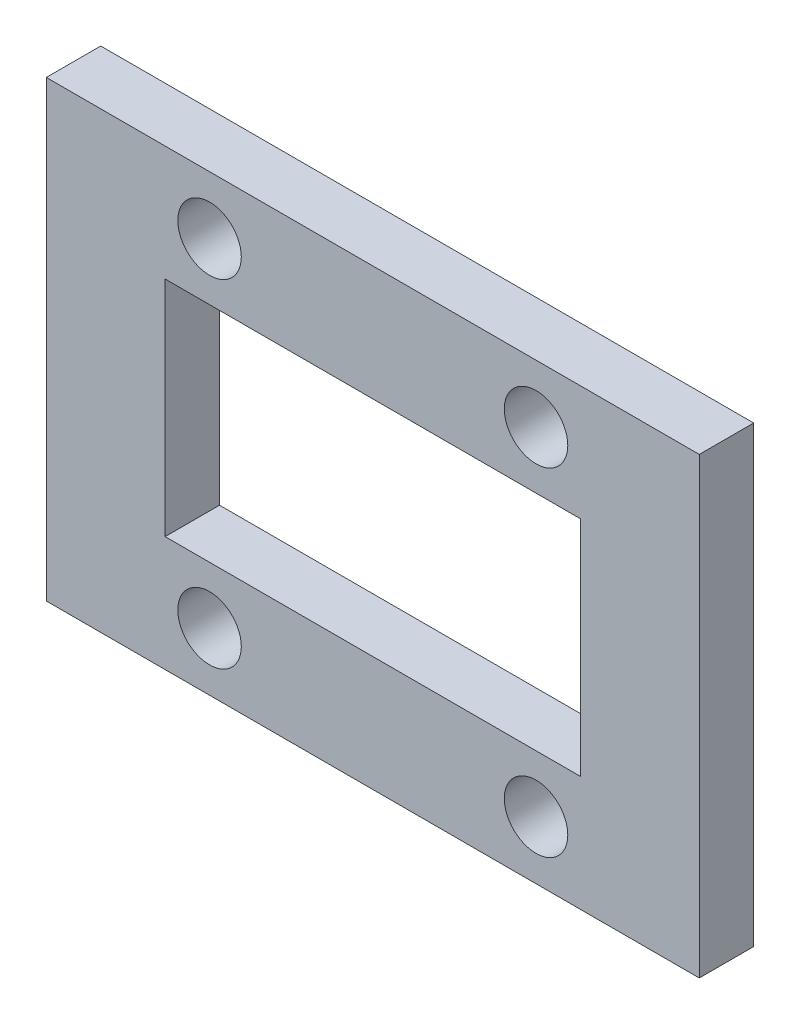
ISO-10303-21;
HEADER;
FILE_DESCRIPTION(('STEP AP214'),'2;1');
FILE_NAME('part.step','',(''),(''),'','','');
FILE_SCHEMA(('AUTOMOTIVE_DESIGN { 1 0 10303 214 1 1 1 1 }'));
ENDSEC;
DATA;
#1=APPLICATION_CONTEXT('core data for automotive mechanical design processes');
#2=APPLICATION_PROTOCOL_DEFINITION('international standard','automotive_design',2000,#1);
#3=PRODUCT_CONTEXT('',#1,'mechanical');
#4=PRODUCT('Part','Part','',(#3));
#5=PRODUCT_RELATED_PRODUCT_CATEGORY('part','',(#4));
#6=PRODUCT_DEFINITION_FORMATION('','',#4);
#7=PRODUCT_DEFINITION_CONTEXT('part definition',#1,'design');
#8=PRODUCT_DEFINITION('design','',#6,#7);
#9=PRODUCT_DEFINITION_SHAPE('','',#8);
#10=(LENGTH_UNIT() NAMED_UNIT(*) SI_UNIT(.MILLI.,.METRE.));
#11=(NAMED_UNIT(*) PLANE_ANGLE_UNIT() SI_UNIT($,.RADIAN.));
#12=(NAMED_UNIT(*) SI_UNIT($,.STERADIAN.) SOLID_ANGLE_UNIT());
#13=UNCERTAINTY_MEASURE_WITH_UNIT(LENGTH_MEASURE(1.E-05),#10,'distance_accuracy_value','');
#14=(GEOMETRIC_REPRESENTATION_CONTEXT(3) GLOBAL_UNCERTAINTY_ASSIGNED_CONTEXT((#13)) GLOBAL_UNIT_ASSIGNED_CONTEXT((#10,
#11,#12)) REPRESENTATION_CONTEXT('',''));
#15=CARTESIAN_POINT('',(0.,0.,0.));
#16=DIRECTION('',(0.,0.,1.));
#17=DIRECTION('',(1.,0.,0.));
#18=AXIS2_PLACEMENT_3D('',#15,#16,#17);
#19=CARTESIAN_POINT('',(253.7,9.3,22.75));
#20=DIRECTION('',(0.,0.,1.));
#21=DIRECTION('',(1.,0.,0.));
#22=AXIS2_PLACEMENT_3D('',#19,#20,#21);
#23=CYLINDRICAL_SURFACE('',#22,1.75);
#24=DIRECTION('',(0.,0.,1.));
#25=VECTOR('',#24,1.);
#26=CARTESIAN_POINT('',(255.45,9.3,22.75));
#27=LINE('',#26,#25);
#28=CARTESIAN_POINT('',(255.45,9.3,23.75));
#29=VERTEX_POINT('',#28);
#30=CARTESIAN_POINT('',(255.45,9.3,26.75));
#31=VERTEX_POINT('',#30);
#32=EDGE_CURVE('E10',#29,#31,#27,.T.);
#33=ORIENTED_EDGE('',*,*,#32,.F.);
#34=CARTESIAN_POINT('',(253.7,9.3,23.75));
#35=DIRECTION('',(0.,0.,1.));
#36=DIRECTION('',(1.,0.,0.));
#37=AXIS2_PLACEMENT_3D('',#34,#35,#36);
#38=CIRCLE('',#37,1.75);
#39=EDGE_CURVE('E246',#29,#29,#38,.T.);
#40=ORIENTED_EDGE('',*,*,#39,.F.);
#41=ORIENTED_EDGE('',*,*,#32,.T.);
#42=CARTESIAN_POINT('',(253.7,9.3,26.75));
#43=DIRECTION('',(0.,0.,1.));
#44=DIRECTION('',(1.,0.,0.));
#45=AXIS2_PLACEMENT_3D('',#42,#43,#44);
#46=CIRCLE('',#45,1.75);
#47=EDGE_CURVE('E221',#31,#31,#46,.T.);
#48=ORIENTED_EDGE('',*,*,#47,.T.);
#49=EDGE_LOOP('',(#33,#40,#41,#48));
#50=FACE_BOUND('',#49,.T.);
#51=ADVANCED_FACE('F15',(#50),#23,.F.);
#52=CARTESIAN_POINT('',(233.25,6.15,22.75));
#53=DIRECTION('',(0.,1.,0.));
#54=DIRECTION('',(1.,0.,0.));
#55=AXIS2_PLACEMENT_3D('',#52,#53,#54);
#56=PLANE('',#55);
#57=DIRECTION('',(-1.,0.,0.));
#58=VECTOR('',#57,1.);
#59=CARTESIAN_POINT('',(229.975,6.15,26.75));
#60=LINE('',#59,#58);
#61=CARTESIAN_POINT('',(256.15,6.15,26.75));
#62=VERTEX_POINT('',#61);
#63=CARTESIAN_POINT('',(233.25,6.15,26.75));
#64=VERTEX_POINT('',#63);
#65=EDGE_CURVE('E200',#62,#64,#60,.T.);
#66=ORIENTED_EDGE('',*,*,#65,.T.);
#67=DIRECTION('',(0.,0.,1.));
#68=VECTOR('',#67,1.);
#69=CARTESIAN_POINT('',(233.25,6.15,22.75));
#70=LINE('',#69,#68);
#71=CARTESIAN_POINT('',(233.25,6.15,23.75));
#72=VERTEX_POINT('',#71);
#73=EDGE_CURVE('E23',#72,#64,#70,.T.);
#74=ORIENTED_EDGE('',*,*,#73,.F.);
#75=DIRECTION('',(-1.,0.,0.));
#76=VECTOR('',#75,1.);
#77=CARTESIAN_POINT('',(229.975,6.15,23.75));
#78=LINE('',#77,#76);
#79=CARTESIAN_POINT('',(256.15,6.15,23.75));
#80=VERTEX_POINT('',#79);
#81=EDGE_CURVE('E177',#80,#72,#78,.T.);
#82=ORIENTED_EDGE('',*,*,#81,.F.);
#83=DIRECTION('',(0.,0.,1.));
#84=VECTOR('',#83,1.);
#85=CARTESIAN_POINT('',(256.15,6.15,22.75));
#86=LINE('',#85,#84);
#87=EDGE_CURVE('E263',#80,#62,#86,.T.);
#88=ORIENTED_EDGE('',*,*,#87,.T.);
#89=EDGE_LOOP('',(#66,#74,#82,#88));
#90=FACE_BOUND('',#89,.T.);
#91=ADVANCED_FACE('F272',(#90),#56,.F.);
#92=CARTESIAN_POINT('',(233.25,-6.15,22.75));
#93=DIRECTION('',(1.,0.,0.));
#94=DIRECTION('',(0.,1.,0.));
#95=AXIS2_PLACEMENT_3D('',#92,#93,#94);
#96=PLANE('',#95);
#97=DIRECTION('',(0.,0.,1.));
#98=VECTOR('',#97,1.);
#99=CARTESIAN_POINT('',(233.25,-6.15,22.75));
#100=LINE('',#99,#98);
#101=CARTESIAN_POINT('',(233.25,-6.15,23.75));
#102=VERTEX_POINT('',#101);
#103=CARTESIAN_POINT('',(233.25,-6.15,26.75));
#104=VERTEX_POINT('',#103);
#105=EDGE_CURVE('E43',#102,#104,#100,.T.);
#106=ORIENTED_EDGE('',*,*,#105,.F.);
#107=DIRECTION('',(0.,1.,0.));
#108=VECTOR('',#107,1.);
#109=CARTESIAN_POINT('',(233.25,-9.325,23.75));
#110=LINE('',#109,#108);
#111=EDGE_CURVE('E237',#102,#72,#110,.T.);
#112=ORIENTED_EDGE('',*,*,#111,.T.);
#113=ORIENTED_EDGE('',*,*,#73,.T.);
#114=DIRECTION('',(0.,1.,0.));
#115=VECTOR('',#114,1.);
#116=CARTESIAN_POINT('',(233.25,-9.325,26.75));
#117=LINE('',#116,#115);
#118=EDGE_CURVE('E190',#104,#64,#117,.T.);
#119=ORIENTED_EDGE('',*,*,#118,.F.);
#120=EDGE_LOOP('',(#106,#112,#113,#119));
#121=FACE_BOUND('',#120,.T.);
#122=ADVANCED_FACE('F267',(#121),#96,.T.);
#123=CARTESIAN_POINT('',(256.15,-6.15,22.75));
#124=DIRECTION('',(1.,0.,0.));
#125=DIRECTION('',(0.,1.,0.));
#126=AXIS2_PLACEMENT_3D('',#123,#124,#125);
#127=PLANE('',#126);
#128=DIRECTION('',(0.,1.,0.));
#129=VECTOR('',#128,1.);
#130=CARTESIAN_POINT('',(256.15,-9.325,26.75));
#131=LINE('',#130,#129);
#132=CARTESIAN_POINT('',(256.15,-6.15,26.75));
#133=VERTEX_POINT('',#132);
#134=EDGE_CURVE('E204',#133,#62,#131,.T.);
#135=ORIENTED_EDGE('',*,*,#134,.T.);
#136=ORIENTED_EDGE('',*,*,#87,.F.);
#137=DIRECTION('',(0.,1.,0.));
#138=VECTOR('',#137,1.);
#139=CARTESIAN_POINT('',(256.15,-9.325,23.75));
#140=LINE('',#139,#138);
#141=CARTESIAN_POINT('',(256.15,-6.15,23.75));
#142=VERTEX_POINT('',#141);
#143=EDGE_CURVE('E174',#142,#80,#140,.T.);
#144=ORIENTED_EDGE('',*,*,#143,.F.);
#145=DIRECTION('',(0.,0.,1.));
#146=VECTOR('',#145,1.);
#147=CARTESIAN_POINT('',(256.15,-6.15,22.75));
#148=LINE('',#147,#146);
#149=EDGE_CURVE('E258',#142,#133,#148,.T.);
#150=ORIENTED_EDGE('',*,*,#149,.T.);
#151=EDGE_LOOP('',(#135,#136,#144,#150));
#152=FACE_BOUND('',#151,.T.);
#153=ADVANCED_FACE('F285',(#152),#127,.F.);
#154=CARTESIAN_POINT('',(233.25,-6.15,22.75));
#155=DIRECTION('',(0.,1.,0.));
#156=DIRECTION('',(1.,0.,0.));
#157=AXIS2_PLACEMENT_3D('',#154,#155,#156);
#158=PLANE('',#157);
#159=ORIENTED_EDGE('',*,*,#149,.F.);
#160=DIRECTION('',(-1.,0.,0.));
#161=VECTOR('',#160,1.);
#162=CARTESIAN_POINT('',(229.975,-6.15,23.75));
#163=LINE('',#162,#161);
#164=EDGE_CURVE('E243',#142,#102,#163,.T.);
#165=ORIENTED_EDGE('',*,*,#164,.T.);
#166=ORIENTED_EDGE('',*,*,#105,.T.);
#167=DIRECTION('',(-1.,0.,0.));
#168=VECTOR('',#167,1.);
#169=CARTESIAN_POINT('',(229.975,-6.15,26.75));
#170=LINE('',#169,#168);
#171=EDGE_CURVE('E186',#133,#104,#170,.T.);
#172=ORIENTED_EDGE('',*,*,#171,.F.);
#173=EDGE_LOOP('',(#159,#165,#166,#172));
#174=FACE_BOUND('',#173,.T.);
#175=ADVANCED_FACE('F278',(#174),#158,.T.);
#176=CARTESIAN_POINT('',(235.7,9.3,22.75));
#177=DIRECTION('',(0.,0.,1.));
#178=DIRECTION('',(1.,0.,0.));
#179=AXIS2_PLACEMENT_3D('',#176,#177,#178);
#180=CYLINDRICAL_SURFACE('',#179,1.75);
#181=DIRECTION('',(0.,0.,1.));
#182=VECTOR('',#181,1.);
#183=CARTESIAN_POINT('',(237.45,9.3,22.75));
#184=LINE('',#183,#182);
#185=CARTESIAN_POINT('',(237.45,9.3,23.75));
#186=VERTEX_POINT('',#185);
#187=CARTESIAN_POINT('',(237.45,9.3,26.75));
#188=VERTEX_POINT('',#187);
#189=EDGE_CURVE('E255',#186,#188,#184,.T.);
#190=ORIENTED_EDGE('',*,*,#189,.F.);
#191=CARTESIAN_POINT('',(235.7,9.3,23.75));
#192=DIRECTION('',(0.,0.,1.));
#193=DIRECTION('',(1.,0.,0.));
#194=AXIS2_PLACEMENT_3D('',#191,#192,#193);
#195=CIRCLE('',#194,1.75);
#196=EDGE_CURVE('E178',#186,#186,#195,.T.);
#197=ORIENTED_EDGE('',*,*,#196,.F.);
#198=ORIENTED_EDGE('',*,*,#189,.T.);
#199=CARTESIAN_POINT('',(235.7,9.3,26.75));
#200=DIRECTION('',(0.,0.,1.));
#201=DIRECTION('',(1.,0.,0.));
#202=AXIS2_PLACEMENT_3D('',#199,#200,#201);
#203=CIRCLE('',#202,1.75);
#204=EDGE_CURVE('E191',#188,#188,#203,.T.);
#205=ORIENTED_EDGE('',*,*,#204,.T.);
#206=EDGE_LOOP('',(#190,#197,#198,#205));
#207=FACE_BOUND('',#206,.T.);
#208=ADVANCED_FACE('F293',(#207),#180,.F.);
#209=CARTESIAN_POINT('',(253.7,-9.3,22.75));
#210=DIRECTION('',(0.,0.,1.));
#211=DIRECTION('',(1.,0.,0.));
#212=AXIS2_PLACEMENT_3D('',#209,#210,#211);
#213=CYLINDRICAL_SURFACE('',#212,1.75);
#214=DIRECTION('',(0.,0.,1.));
#215=VECTOR('',#214,1.);
#216=CARTESIAN_POINT('',(255.45,-9.3,22.75));
#217=LINE('',#216,#215);
#218=CARTESIAN_POINT('',(255.45,-9.3,23.75));
#219=VERTEX_POINT('',#218);
#220=CARTESIAN_POINT('',(255.45,-9.3,26.75));
#221=VERTEX_POINT('',#220);
#222=EDGE_CURVE('E252',#219,#221,#217,.T.);
#223=ORIENTED_EDGE('',*,*,#222,.F.);
#224=CARTESIAN_POINT('',(253.7,-9.3,23.75));
#225=DIRECTION('',(0.,0.,1.));
#226=DIRECTION('',(1.,0.,0.));
#227=AXIS2_PLACEMENT_3D('',#224,#225,#226);
#228=CIRCLE('',#227,1.75);
#229=EDGE_CURVE('E183',#219,#219,#228,.T.);
#230=ORIENTED_EDGE('',*,*,#229,.F.);
#231=ORIENTED_EDGE('',*,*,#222,.T.);
#232=CARTESIAN_POINT('',(253.7,-9.3,26.75));
#233=DIRECTION('',(0.,0.,1.));
#234=DIRECTION('',(1.,0.,0.));
#235=AXIS2_PLACEMENT_3D('',#232,#233,#234);
#236=CIRCLE('',#235,1.75);
#237=EDGE_CURVE('E211',#221,#221,#236,.T.);
#238=ORIENTED_EDGE('',*,*,#237,.T.);
#239=EDGE_LOOP('',(#223,#230,#231,#238));
#240=FACE_BOUND('',#239,.T.);
#241=ADVANCED_FACE('F308',(#240),#213,.F.);
#242=CARTESIAN_POINT('',(235.7,-9.3,22.75));
#243=DIRECTION('',(0.,0.,1.));
#244=DIRECTION('',(1.,0.,0.));
#245=AXIS2_PLACEMENT_3D('',#242,#243,#244);
#246=CYLINDRICAL_SURFACE('',#245,1.75);
#247=DIRECTION('',(0.,0.,1.));
#248=VECTOR('',#247,1.);
#249=CARTESIAN_POINT('',(237.45,-9.3,22.75));
#250=LINE('',#249,#248);
#251=CARTESIAN_POINT('',(237.45,-9.3,23.75));
#252=VERTEX_POINT('',#251);
#253=CARTESIAN_POINT('',(237.45,-9.3,26.75));
#254=VERTEX_POINT('',#253);
#255=EDGE_CURVE('E249',#252,#254,#250,.T.);
#256=ORIENTED_EDGE('',*,*,#255,.F.);
#257=CARTESIAN_POINT('',(235.7,-9.3,23.75));
#258=DIRECTION('',(0.,0.,1.));
#259=DIRECTION('',(1.,0.,0.));
#260=AXIS2_PLACEMENT_3D('',#257,#258,#259);
#261=CIRCLE('',#260,1.75);
#262=EDGE_CURVE('E170',#252,#252,#261,.T.);
#263=ORIENTED_EDGE('',*,*,#262,.F.);
#264=ORIENTED_EDGE('',*,*,#255,.T.);
#265=CARTESIAN_POINT('',(235.7,-9.3,26.75));
#266=DIRECTION('',(0.,0.,1.));
#267=DIRECTION('',(1.,0.,0.));
#268=AXIS2_PLACEMENT_3D('',#265,#266,#267);
#269=CIRCLE('',#268,1.75);
#270=EDGE_CURVE('E199',#254,#254,#269,.T.);
#271=ORIENTED_EDGE('',*,*,#270,.T.);
#272=EDGE_LOOP('',(#256,#263,#264,#271));
#273=FACE_BOUND('',#272,.T.);
#274=ADVANCED_FACE('F325',(#273),#246,.F.);
#275=CARTESIAN_POINT('',(262.7,-12.5,23.75));
#276=DIRECTION('',(1.,0.,0.));
#277=DIRECTION('',(0.,1.,0.));
#278=AXIS2_PLACEMENT_3D('',#275,#276,#277);
#279=PLANE('',#278);
#280=DIRECTION('',(0.,0.,1.));
#281=VECTOR('',#280,1.);
#282=CARTESIAN_POINT('',(262.7,-12.5,23.75));
#283=LINE('',#282,#281);
#284=CARTESIAN_POINT('',(262.7,-12.5,23.75));
#285=VERTEX_POINT('',#284);
#286=CARTESIAN_POINT('',(262.7,-12.5,26.75));
#287=VERTEX_POINT('',#286);
#288=EDGE_CURVE('E142',#285,#287,#283,.T.);
#289=ORIENTED_EDGE('',*,*,#288,.F.);
#290=DIRECTION('',(0.,1.,0.));
#291=VECTOR('',#290,1.);
#292=CARTESIAN_POINT('',(262.7,-12.5,23.75));
#293=LINE('',#292,#291);
#294=CARTESIAN_POINT('',(262.7,12.5,23.75));
#295=VERTEX_POINT('',#294);
#296=EDGE_CURVE('E231',#285,#295,#293,.T.);
#297=ORIENTED_EDGE('',*,*,#296,.T.);
#298=DIRECTION('',(0.,0.,1.));
#299=VECTOR('',#298,1.);
#300=CARTESIAN_POINT('',(262.7,12.5,23.75));
#301=LINE('',#300,#299);
#302=CARTESIAN_POINT('',(262.7,12.5,26.75));
#303=VERTEX_POINT('',#302);
#304=EDGE_CURVE('E228',#295,#303,#301,.T.);
#305=ORIENTED_EDGE('',*,*,#304,.T.);
#306=DIRECTION('',(0.,1.,0.));
#307=VECTOR('',#306,1.);
#308=CARTESIAN_POINT('',(262.7,-12.5,26.75));
#309=LINE('',#308,#307);
#310=EDGE_CURVE('E192',#287,#303,#309,.T.);
#311=ORIENTED_EDGE('',*,*,#310,.F.);
#312=EDGE_LOOP('',(#289,#297,#305,#311));
#313=FACE_BOUND('',#312,.T.);
#314=ADVANCED_FACE('F321',(#313),#279,.T.);
#315=CARTESIAN_POINT('',(226.7,-12.5,23.75));
#316=DIRECTION('',(0.,0.,1.));
#317=DIRECTION('',(1.,0.,0.));
#318=AXIS2_PLACEMENT_3D('',#315,#316,#317);
#319=PLANE('',#318);
#320=ORIENTED_EDGE('',*,*,#39,.T.);
#321=EDGE_LOOP('',(#320));
#322=FACE_BOUND('',#321,.T.);
#323=ORIENTED_EDGE('',*,*,#143,.T.);
#324=ORIENTED_EDGE('',*,*,#81,.T.);
#325=ORIENTED_EDGE('',*,*,#111,.F.);
#326=ORIENTED_EDGE('',*,*,#164,.F.);
#327=EDGE_LOOP('',(#323,#324,#325,#326));
#328=FACE_BOUND('',#327,.T.);
#329=ORIENTED_EDGE('',*,*,#196,.T.);
#330=EDGE_LOOP('',(#329));
#331=FACE_BOUND('',#330,.T.);
#332=ORIENTED_EDGE('',*,*,#229,.T.);
#333=EDGE_LOOP('',(#332));
#334=FACE_BOUND('',#333,.T.);
#335=ORIENTED_EDGE('',*,*,#262,.T.);
#336=EDGE_LOOP('',(#335));
#337=FACE_BOUND('',#336,.T.);
#338=DIRECTION('',(1.,0.,0.));
#339=VECTOR('',#338,1.);
#340=CARTESIAN_POINT('',(226.7,12.5,23.75));
#341=LINE('',#340,#339);
#342=CARTESIAN_POINT('',(226.7,12.5,23.75));
#343=VERTEX_POINT('',#342);
#344=EDGE_CURVE('E224',#343,#295,#341,.T.);
#345=ORIENTED_EDGE('',*,*,#344,.T.);
#346=ORIENTED_EDGE('',*,*,#296,.F.);
#347=DIRECTION('',(1.,0.,0.));
#348=VECTOR('',#347,1.);
#349=CARTESIAN_POINT('',(226.7,-12.5,23.75));
#350=LINE('',#349,#348);
#351=CARTESIAN_POINT('',(226.7,-12.5,23.75));
#352=VERTEX_POINT('',#351);
#353=EDGE_CURVE('E147',#352,#285,#350,.T.);
#354=ORIENTED_EDGE('',*,*,#353,.F.);
#355=DIRECTION('',(0.,1.,0.));
#356=VECTOR('',#355,1.);
#357=CARTESIAN_POINT('',(226.7,-12.5,23.75));
#358=LINE('',#357,#356);
#359=EDGE_CURVE('E155',#352,#343,#358,.T.);
#360=ORIENTED_EDGE('',*,*,#359,.T.);
#361=EDGE_LOOP('',(#345,#346,#354,#360));
#362=FACE_BOUND('',#361,.T.);
#363=ADVANCED_FACE('F282',(#322,#328,#331,#334,#337,#362),#319,.F.);
#364=CARTESIAN_POINT('',(226.7,12.5,23.75));
#365=DIRECTION('',(0.,1.,0.));
#366=DIRECTION('',(1.,0.,0.));
#367=AXIS2_PLACEMENT_3D('',#364,#365,#366);
#368=PLANE('',#367);
#369=ORIENTED_EDGE('',*,*,#344,.F.);
#370=DIRECTION('',(0.,0.,1.));
#371=VECTOR('',#370,1.);
#372=CARTESIAN_POINT('',(226.7,12.5,23.75));
#373=LINE('',#372,#371);
#374=CARTESIAN_POINT('',(226.7,12.5,26.75));
#375=VERTEX_POINT('',#374);
#376=EDGE_CURVE('E163',#343,#375,#373,.T.);
#377=ORIENTED_EDGE('',*,*,#376,.T.);
#378=DIRECTION('',(1.,0.,0.));
#379=VECTOR('',#378,1.);
#380=CARTESIAN_POINT('',(226.7,12.5,26.75));
#381=LINE('',#380,#379);
#382=EDGE_CURVE('E160',#375,#303,#381,.T.);
#383=ORIENTED_EDGE('',*,*,#382,.T.);
#384=ORIENTED_EDGE('',*,*,#304,.F.);
#385=EDGE_LOOP('',(#369,#377,#383,#384));
#386=FACE_BOUND('',#385,.T.);
#387=ADVANCED_FACE('F314',(#386),#368,.T.);
#388=CARTESIAN_POINT('',(226.7,-12.5,26.75));
#389=DIRECTION('',(0.,0.,1.));
#390=DIRECTION('',(1.,0.,0.));
#391=AXIS2_PLACEMENT_3D('',#388,#389,#390);
#392=PLANE('',#391);
#393=ORIENTED_EDGE('',*,*,#47,.F.);
#394=EDGE_LOOP('',(#393));
#395=FACE_BOUND('',#394,.T.);
#396=ORIENTED_EDGE('',*,*,#171,.T.);
#397=ORIENTED_EDGE('',*,*,#118,.T.);
#398=ORIENTED_EDGE('',*,*,#65,.F.);
#399=ORIENTED_EDGE('',*,*,#134,.F.);
#400=EDGE_LOOP('',(#396,#397,#398,#399));
#401=FACE_BOUND('',#400,.T.);
#402=ORIENTED_EDGE('',*,*,#204,.F.);
#403=EDGE_LOOP('',(#402));
#404=FACE_BOUND('',#403,.T.);
#405=ORIENTED_EDGE('',*,*,#237,.F.);
#406=EDGE_LOOP('',(#405));
#407=FACE_BOUND('',#406,.T.);
#408=ORIENTED_EDGE('',*,*,#270,.F.);
#409=EDGE_LOOP('',(#408));
#410=FACE_BOUND('',#409,.T.);
#411=DIRECTION('',(0.,1.,0.));
#412=VECTOR('',#411,1.);
#413=CARTESIAN_POINT('',(226.7,-12.5,26.75));
#414=LINE('',#413,#412);
#415=CARTESIAN_POINT('',(226.7,-12.5,26.75));
#416=VERTEX_POINT('',#415);
#417=EDGE_CURVE('E153',#416,#375,#414,.T.);
#418=ORIENTED_EDGE('',*,*,#417,.F.);
#419=DIRECTION('',(1.,0.,0.));
#420=VECTOR('',#419,1.);
#421=CARTESIAN_POINT('',(226.7,-12.5,26.75));
#422=LINE('',#421,#420);
#423=EDGE_CURVE('E135',#416,#287,#422,.T.);
#424=ORIENTED_EDGE('',*,*,#423,.T.);
#425=ORIENTED_EDGE('',*,*,#310,.T.);
#426=ORIENTED_EDGE('',*,*,#382,.F.);
#427=EDGE_LOOP('',(#418,#424,#425,#426));
#428=FACE_BOUND('',#427,.T.);
#429=ADVANCED_FACE('F158',(#395,#401,#404,#407,#410,#428),#392,.T.);
#430=CARTESIAN_POINT('',(226.7,-12.5,23.75));
#431=DIRECTION('',(0.,1.,0.));
#432=DIRECTION('',(1.,0.,0.));
#433=AXIS2_PLACEMENT_3D('',#430,#431,#432);
#434=PLANE('',#433);
#435=ORIENTED_EDGE('',*,*,#288,.T.);
#436=ORIENTED_EDGE('',*,*,#423,.F.);
#437=DIRECTION('',(0.,0.,1.));
#438=VECTOR('',#437,1.);
#439=CARTESIAN_POINT('',(226.7,-12.5,23.75));
#440=LINE('',#439,#438);
#441=EDGE_CURVE('E139',#352,#416,#440,.T.);
#442=ORIENTED_EDGE('',*,*,#441,.F.);
#443=ORIENTED_EDGE('',*,*,#353,.T.);
#444=EDGE_LOOP('',(#435,#436,#442,#443));
#445=FACE_BOUND('',#444,.T.);
#446=ADVANCED_FACE('F137',(#445),#434,.F.);
#447=CARTESIAN_POINT('',(226.7,-12.5,23.75));
#448=DIRECTION('',(1.,0.,0.));
#449=DIRECTION('',(0.,1.,0.));
#450=AXIS2_PLACEMENT_3D('',#447,#448,#449);
#451=PLANE('',#450);
#452=ORIENTED_EDGE('',*,*,#417,.T.);
#453=ORIENTED_EDGE('',*,*,#376,.F.);
#454=ORIENTED_EDGE('',*,*,#359,.F.);
#455=ORIENTED_EDGE('',*,*,#441,.T.);
#456=EDGE_LOOP('',(#452,#453,#454,#455));
#457=FACE_BOUND('',#456,.T.);
#458=ADVANCED_FACE('F151',(#457),#451,.F.);
#459=CLOSED_SHELL('',(#51,#91,#122,#153,#175,#208,#241,#274,#314,#363,#387,#429,#446,#458));
#460=MANIFOLD_SOLID_BREP('B1',#459);
#461=ADVANCED_BREP_SHAPE_REPRESENTATION('',(#18,#460),#14);
#462=SHAPE_DEFINITION_REPRESENTATION(#9,#461);
ENDSEC;
END-ISO-10303-21;
